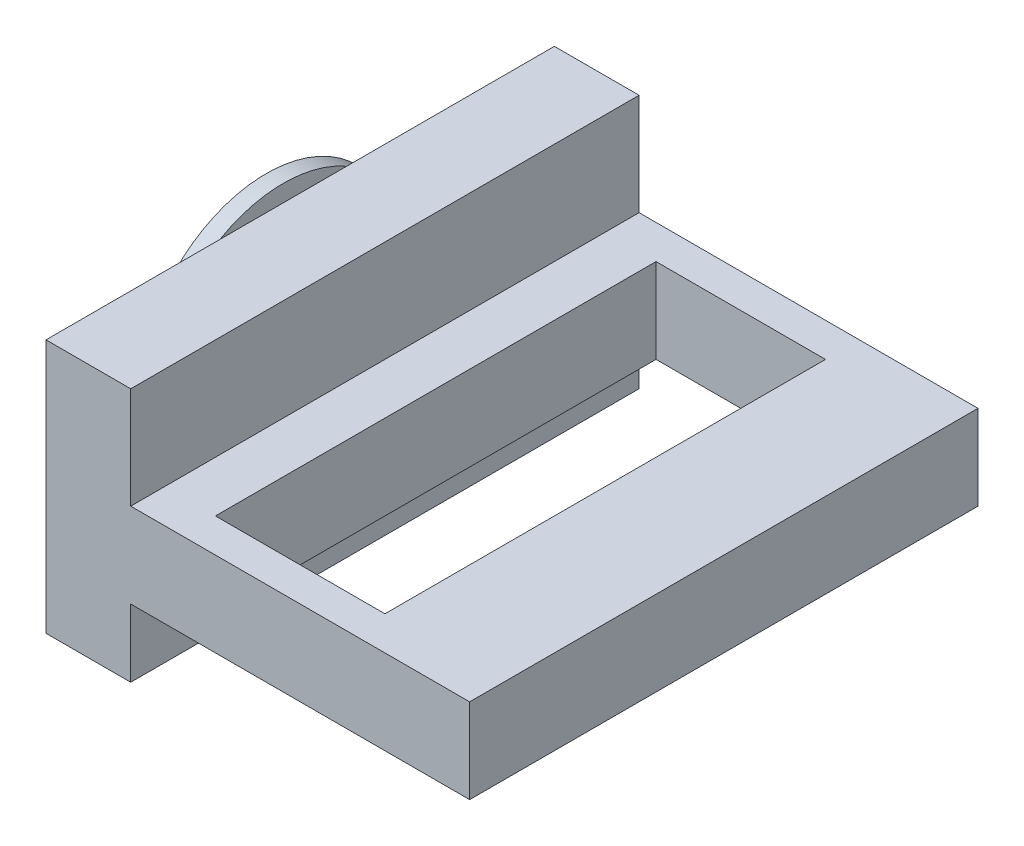
ISO-10303-21;
HEADER;
FILE_DESCRIPTION(('STEP AP214'),'2;1');
FILE_NAME('part.step','',(''),(''),'','','');
FILE_SCHEMA(('AUTOMOTIVE_DESIGN { 1 0 10303 214 1 1 1 1 }'));
ENDSEC;
DATA;
#1=APPLICATION_CONTEXT('core data for automotive mechanical design processes');
#2=APPLICATION_PROTOCOL_DEFINITION('international standard','automotive_design',2000,#1);
#3=PRODUCT_CONTEXT('',#1,'mechanical');
#4=PRODUCT('Part','Part','',(#3));
#5=PRODUCT_RELATED_PRODUCT_CATEGORY('part','',(#4));
#6=PRODUCT_DEFINITION_FORMATION('','',#4);
#7=PRODUCT_DEFINITION_CONTEXT('part definition',#1,'design');
#8=PRODUCT_DEFINITION('design','',#6,#7);
#9=PRODUCT_DEFINITION_SHAPE('','',#8);
#10=(LENGTH_UNIT() NAMED_UNIT(*) SI_UNIT(.MILLI.,.METRE.));
#11=(NAMED_UNIT(*) PLANE_ANGLE_UNIT() SI_UNIT($,.RADIAN.));
#12=(NAMED_UNIT(*) SI_UNIT($,.STERADIAN.) SOLID_ANGLE_UNIT());
#13=UNCERTAINTY_MEASURE_WITH_UNIT(LENGTH_MEASURE(1.E-05),#10,'distance_accuracy_value','');
#14=(GEOMETRIC_REPRESENTATION_CONTEXT(3) GLOBAL_UNCERTAINTY_ASSIGNED_CONTEXT((#13)) GLOBAL_UNIT_ASSIGNED_CONTEXT((#10,
#11,#12)) REPRESENTATION_CONTEXT('',''));
#15=CARTESIAN_POINT('',(0.,0.,0.));
#16=DIRECTION('',(0.,0.,1.));
#17=DIRECTION('',(1.,0.,0.));
#18=AXIS2_PLACEMENT_3D('',#15,#16,#17);
#19=CARTESIAN_POINT('',(-5.17985471020153,6.18497109826589,30.));
#20=DIRECTION('',(0.,-1.,0.));
#21=DIRECTION('',(0.,0.,-1.));
#22=AXIS2_PLACEMENT_3D('',#19,#20,#21);
#23=PLANE('',#22);
#24=DIRECTION('',(-1.,0.,0.));
#25=VECTOR('',#24,1.);
#26=CARTESIAN_POINT('',(-5.17985471020153,6.18497109826589,0.));
#27=LINE('',#26,#25);
#28=CARTESIAN_POINT('',(-5.17985471020153,6.18497109826589,0.));
#29=VERTEX_POINT('',#28);
#30=CARTESIAN_POINT('',(-10.1798547102015,6.18497109826589,0.));
#31=VERTEX_POINT('',#30);
#32=EDGE_CURVE('E172',#29,#31,#27,.T.);
#33=ORIENTED_EDGE('',*,*,#32,.T.);
#34=DIRECTION('',(0.,0.,-1.));
#35=VECTOR('',#34,1.);
#36=CARTESIAN_POINT('',(-10.1798547102015,6.18497109826589,30.));
#37=LINE('',#36,#35);
#38=CARTESIAN_POINT('',(-10.1798547102015,6.18497109826589,30.));
#39=VERTEX_POINT('',#38);
#40=EDGE_CURVE('E49',#39,#31,#37,.T.);
#41=ORIENTED_EDGE('',*,*,#40,.F.);
#42=DIRECTION('',(-1.,0.,0.));
#43=VECTOR('',#42,1.);
#44=CARTESIAN_POINT('',(-5.17985471020153,6.18497109826589,30.));
#45=LINE('',#44,#43);
#46=CARTESIAN_POINT('',(-5.17985471020153,6.18497109826589,30.));
#47=VERTEX_POINT('',#46);
#48=EDGE_CURVE('E176',#47,#39,#45,.T.);
#49=ORIENTED_EDGE('',*,*,#48,.F.);
#50=DIRECTION('',(0.,0.,-1.));
#51=VECTOR('',#50,1.);
#52=CARTESIAN_POINT('',(-5.17985471020153,6.18497109826589,30.));
#53=LINE('',#52,#51);
#54=EDGE_CURVE('E194',#47,#29,#53,.T.);
#55=ORIENTED_EDGE('',*,*,#54,.T.);
#56=EDGE_LOOP('',(#33,#41,#49,#55));
#57=FACE_BOUND('',#56,.T.);
#58=ADVANCED_FACE('F46',(#57),#23,.F.);
#59=CARTESIAN_POINT('',(-10.1798547102015,6.18497109826589,30.));
#60=DIRECTION('',(1.,0.,0.));
#61=DIRECTION('',(0.,0.,-1.));
#62=AXIS2_PLACEMENT_3D('',#59,#60,#61);
#63=PLANE('',#62);
#64=CARTESIAN_POINT('',(-10.1798547102015,-1.31502890173411,15.));
#65=DIRECTION('',(-1.,0.,0.));
#66=DIRECTION('',(0.,0.,1.));
#67=AXIS2_PLACEMENT_3D('',#64,#65,#66);
#68=CIRCLE('',#67,5.);
#69=CARTESIAN_POINT('',(-10.1798547102015,-1.31502890173411,20.));
#70=VERTEX_POINT('',#69);
#71=EDGE_CURVE('E54',#70,#70,#68,.T.);
#72=ORIENTED_EDGE('',*,*,#71,.F.);
#73=EDGE_LOOP('',(#72));
#74=FACE_BOUND('',#73,.T.);
#75=DIRECTION('',(0.,-1.,0.));
#76=VECTOR('',#75,1.);
#77=CARTESIAN_POINT('',(-10.1798547102015,6.18497109826589,0.));
#78=LINE('',#77,#76);
#79=CARTESIAN_POINT('',(-10.1798547102015,-8.81502890173411,0.));
#80=VERTEX_POINT('',#79);
#81=EDGE_CURVE('E197',#31,#80,#78,.T.);
#82=ORIENTED_EDGE('',*,*,#81,.T.);
#83=DIRECTION('',(0.,0.,-1.));
#84=VECTOR('',#83,1.);
#85=CARTESIAN_POINT('',(-10.1798547102015,-8.81502890173411,30.));
#86=LINE('',#85,#84);
#87=CARTESIAN_POINT('',(-10.1798547102015,-8.81502890173411,30.));
#88=VERTEX_POINT('',#87);
#89=EDGE_CURVE('E226',#88,#80,#86,.T.);
#90=ORIENTED_EDGE('',*,*,#89,.F.);
#91=DIRECTION('',(0.,-1.,0.));
#92=VECTOR('',#91,1.);
#93=CARTESIAN_POINT('',(-10.1798547102015,6.18497109826589,30.));
#94=LINE('',#93,#92);
#95=EDGE_CURVE('E179',#39,#88,#94,.T.);
#96=ORIENTED_EDGE('',*,*,#95,.F.);
#97=ORIENTED_EDGE('',*,*,#40,.T.);
#98=EDGE_LOOP('',(#82,#90,#96,#97));
#99=FACE_BOUND('',#98,.T.);
#100=ADVANCED_FACE('F240',(#74,#99),#63,.F.);
#101=CARTESIAN_POINT('',(-10.1798547102015,-8.81502890173411,30.));
#102=DIRECTION('',(0.,1.,0.));
#103=DIRECTION('',(0.,0.,1.));
#104=AXIS2_PLACEMENT_3D('',#101,#102,#103);
#105=PLANE('',#104);
#106=DIRECTION('',(1.,0.,0.));
#107=VECTOR('',#106,1.);
#108=CARTESIAN_POINT('',(-10.1798547102015,-8.81502890173411,0.));
#109=LINE('',#108,#107);
#110=CARTESIAN_POINT('',(-5.17985471020152,-8.81502890173411,0.));
#111=VERTEX_POINT('',#110);
#112=EDGE_CURVE('E199',#80,#111,#109,.T.);
#113=ORIENTED_EDGE('',*,*,#112,.T.);
#114=DIRECTION('',(0.,0.,-1.));
#115=VECTOR('',#114,1.);
#116=CARTESIAN_POINT('',(-5.17985471020152,-8.81502890173411,30.));
#117=LINE('',#116,#115);
#118=CARTESIAN_POINT('',(-5.17985471020152,-8.81502890173411,30.));
#119=VERTEX_POINT('',#118);
#120=EDGE_CURVE('E224',#119,#111,#117,.T.);
#121=ORIENTED_EDGE('',*,*,#120,.F.);
#122=DIRECTION('',(1.,0.,0.));
#123=VECTOR('',#122,1.);
#124=CARTESIAN_POINT('',(-10.1798547102015,-8.81502890173411,30.));
#125=LINE('',#124,#123);
#126=EDGE_CURVE('E182',#88,#119,#125,.T.);
#127=ORIENTED_EDGE('',*,*,#126,.F.);
#128=ORIENTED_EDGE('',*,*,#89,.T.);
#129=EDGE_LOOP('',(#113,#121,#127,#128));
#130=FACE_BOUND('',#129,.T.);
#131=ADVANCED_FACE('F242',(#130),#105,.F.);
#132=CARTESIAN_POINT('',(-5.17985471020152,-8.81502890173411,30.));
#133=DIRECTION('',(-1.,0.,0.));
#134=DIRECTION('',(0.,0.,1.));
#135=AXIS2_PLACEMENT_3D('',#132,#133,#134);
#136=PLANE('',#135);
#137=DIRECTION('',(0.,1.,0.));
#138=VECTOR('',#137,1.);
#139=CARTESIAN_POINT('',(-5.17985471020152,-8.81502890173411,0.));
#140=LINE('',#139,#138);
#141=CARTESIAN_POINT('',(-5.17985471020152,-4.81502890173411,0.));
#142=VERTEX_POINT('',#141);
#143=EDGE_CURVE('E201',#111,#142,#140,.T.);
#144=ORIENTED_EDGE('',*,*,#143,.T.);
#145=DIRECTION('',(0.,0.,-1.));
#146=VECTOR('',#145,1.);
#147=CARTESIAN_POINT('',(-5.17985471020152,-4.81502890173411,30.));
#148=LINE('',#147,#146);
#149=CARTESIAN_POINT('',(-5.17985471020152,-4.81502890173411,30.));
#150=VERTEX_POINT('',#149);
#151=EDGE_CURVE('E221',#150,#142,#148,.T.);
#152=ORIENTED_EDGE('',*,*,#151,.F.);
#153=DIRECTION('',(0.,1.,0.));
#154=VECTOR('',#153,1.);
#155=CARTESIAN_POINT('',(-5.17985471020152,-8.81502890173411,30.));
#156=LINE('',#155,#154);
#157=EDGE_CURVE('E184',#119,#150,#156,.T.);
#158=ORIENTED_EDGE('',*,*,#157,.F.);
#159=ORIENTED_EDGE('',*,*,#120,.T.);
#160=EDGE_LOOP('',(#144,#152,#158,#159));
#161=FACE_BOUND('',#160,.T.);
#162=ADVANCED_FACE('F252',(#161),#136,.F.);
#163=CARTESIAN_POINT('',(-5.17985471020152,-4.81502890173411,30.));
#164=DIRECTION('',(0.,1.,0.));
#165=DIRECTION('',(0.,0.,1.));
#166=AXIS2_PLACEMENT_3D('',#163,#164,#165);
#167=PLANE('',#166);
#168=DIRECTION('',(0.,0.,-1.));
#169=VECTOR('',#168,1.);
#170=CARTESIAN_POINT('',(7.82014528979847,-4.81502890173411,28.));
#171=LINE('',#170,#169);
#172=CARTESIAN_POINT('',(7.82014528979847,-4.81502890173411,28.));
#173=VERTEX_POINT('',#172);
#174=CARTESIAN_POINT('',(7.82014528979847,-4.81502890173411,2.));
#175=VERTEX_POINT('',#174);
#176=EDGE_CURVE('E144',#173,#175,#171,.T.);
#177=ORIENTED_EDGE('',*,*,#176,.T.);
#178=DIRECTION('',(-1.,0.,0.));
#179=VECTOR('',#178,1.);
#180=CARTESIAN_POINT('',(7.82014528979847,-4.81502890173411,2.));
#181=LINE('',#180,#179);
#182=CARTESIAN_POINT('',(-2.17985471020153,-4.81502890173411,2.));
#183=VERTEX_POINT('',#182);
#184=EDGE_CURVE('E138',#175,#183,#181,.T.);
#185=ORIENTED_EDGE('',*,*,#184,.T.);
#186=DIRECTION('',(0.,0.,1.));
#187=VECTOR('',#186,1.);
#188=CARTESIAN_POINT('',(-2.17985471020153,-4.81502890173411,2.));
#189=LINE('',#188,#187);
#190=CARTESIAN_POINT('',(-2.17985471020153,-4.81502890173411,28.));
#191=VERTEX_POINT('',#190);
#192=EDGE_CURVE('E147',#183,#191,#189,.T.);
#193=ORIENTED_EDGE('',*,*,#192,.T.);
#194=DIRECTION('',(1.,0.,0.));
#195=VECTOR('',#194,1.);
#196=CARTESIAN_POINT('',(-2.17985471020153,-4.81502890173411,28.));
#197=LINE('',#196,#195);
#198=EDGE_CURVE('E62',#191,#173,#197,.T.);
#199=ORIENTED_EDGE('',*,*,#198,.T.);
#200=EDGE_LOOP('',(#177,#185,#193,#199));
#201=FACE_BOUND('',#200,.T.);
#202=DIRECTION('',(1.,0.,0.));
#203=VECTOR('',#202,1.);
#204=CARTESIAN_POINT('',(-5.17985471020152,-4.81502890173411,0.));
#205=LINE('',#204,#203);
#206=CARTESIAN_POINT('',(14.8201452897985,-4.81502890173411,0.));
#207=VERTEX_POINT('',#206);
#208=EDGE_CURVE('E203',#142,#207,#205,.T.);
#209=ORIENTED_EDGE('',*,*,#208,.T.);
#210=DIRECTION('',(0.,0.,-1.));
#211=VECTOR('',#210,1.);
#212=CARTESIAN_POINT('',(14.8201452897985,-4.81502890173411,30.));
#213=LINE('',#212,#211);
#214=CARTESIAN_POINT('',(14.8201452897985,-4.81502890173411,30.));
#215=VERTEX_POINT('',#214);
#216=EDGE_CURVE('E218',#215,#207,#213,.T.);
#217=ORIENTED_EDGE('',*,*,#216,.F.);
#218=DIRECTION('',(1.,0.,0.));
#219=VECTOR('',#218,1.);
#220=CARTESIAN_POINT('',(-5.17985471020152,-4.81502890173411,30.));
#221=LINE('',#220,#219);
#222=EDGE_CURVE('E186',#150,#215,#221,.T.);
#223=ORIENTED_EDGE('',*,*,#222,.F.);
#224=ORIENTED_EDGE('',*,*,#151,.T.);
#225=EDGE_LOOP('',(#209,#217,#223,#224));
#226=FACE_BOUND('',#225,.T.);
#227=ADVANCED_FACE('F151',(#201,#226),#167,.F.);
#228=CARTESIAN_POINT('',(14.8201452897985,-4.81502890173411,30.));
#229=DIRECTION('',(-1.,0.,0.));
#230=DIRECTION('',(0.,-1.,0.));
#231=AXIS2_PLACEMENT_3D('',#228,#229,#230);
#232=PLANE('',#231);
#233=DIRECTION('',(0.,1.,0.));
#234=VECTOR('',#233,1.);
#235=CARTESIAN_POINT('',(14.8201452897985,-4.81502890173411,0.));
#236=LINE('',#235,#234);
#237=CARTESIAN_POINT('',(14.8201452897985,0.184971098265892,0.));
#238=VERTEX_POINT('',#237);
#239=EDGE_CURVE('E205',#207,#238,#236,.T.);
#240=ORIENTED_EDGE('',*,*,#239,.T.);
#241=DIRECTION('',(0.,0.,-1.));
#242=VECTOR('',#241,1.);
#243=CARTESIAN_POINT('',(14.8201452897985,0.184971098265892,30.));
#244=LINE('',#243,#242);
#245=CARTESIAN_POINT('',(14.8201452897985,0.184971098265892,30.));
#246=VERTEX_POINT('',#245);
#247=EDGE_CURVE('E215',#246,#238,#244,.T.);
#248=ORIENTED_EDGE('',*,*,#247,.F.);
#249=DIRECTION('',(0.,1.,0.));
#250=VECTOR('',#249,1.);
#251=CARTESIAN_POINT('',(14.8201452897985,-4.81502890173411,30.));
#252=LINE('',#251,#250);
#253=EDGE_CURVE('E188',#215,#246,#252,.T.);
#254=ORIENTED_EDGE('',*,*,#253,.F.);
#255=ORIENTED_EDGE('',*,*,#216,.T.);
#256=EDGE_LOOP('',(#240,#248,#254,#255));
#257=FACE_BOUND('',#256,.T.);
#258=ADVANCED_FACE('F273',(#257),#232,.F.);
#259=CARTESIAN_POINT('',(14.8201452897985,0.184971098265892,30.));
#260=DIRECTION('',(0.,-1.,0.));
#261=DIRECTION('',(1.,0.,0.));
#262=AXIS2_PLACEMENT_3D('',#259,#260,#261);
#263=PLANE('',#262);
#264=DIRECTION('',(0.,0.,1.));
#265=VECTOR('',#264,1.);
#266=CARTESIAN_POINT('',(-2.17985471020153,0.18497109826589,2.));
#267=LINE('',#266,#265);
#268=CARTESIAN_POINT('',(-2.17985471020153,0.18497109826589,2.));
#269=VERTEX_POINT('',#268);
#270=CARTESIAN_POINT('',(-2.17985471020153,0.18497109826589,28.));
#271=VERTEX_POINT('',#270);
#272=EDGE_CURVE('E165',#269,#271,#267,.T.);
#273=ORIENTED_EDGE('',*,*,#272,.F.);
#274=DIRECTION('',(-1.,0.,0.));
#275=VECTOR('',#274,1.);
#276=CARTESIAN_POINT('',(7.82014528979847,0.184971098265891,2.));
#277=LINE('',#276,#275);
#278=CARTESIAN_POINT('',(7.82014528979847,0.184971098265891,2.));
#279=VERTEX_POINT('',#278);
#280=EDGE_CURVE('E70',#279,#269,#277,.T.);
#281=ORIENTED_EDGE('',*,*,#280,.F.);
#282=DIRECTION('',(0.,0.,-1.));
#283=VECTOR('',#282,1.);
#284=CARTESIAN_POINT('',(7.82014528979847,0.184971098265891,28.));
#285=LINE('',#284,#283);
#286=CARTESIAN_POINT('',(7.82014528979847,0.184971098265891,28.));
#287=VERTEX_POINT('',#286);
#288=EDGE_CURVE('E154',#287,#279,#285,.T.);
#289=ORIENTED_EDGE('',*,*,#288,.F.);
#290=DIRECTION('',(1.,0.,0.));
#291=VECTOR('',#290,1.);
#292=CARTESIAN_POINT('',(-2.17985471020153,0.18497109826589,28.));
#293=LINE('',#292,#291);
#294=EDGE_CURVE('E157',#271,#287,#293,.T.);
#295=ORIENTED_EDGE('',*,*,#294,.F.);
#296=EDGE_LOOP('',(#273,#281,#289,#295));
#297=FACE_BOUND('',#296,.T.);
#298=DIRECTION('',(-1.,0.,0.));
#299=VECTOR('',#298,1.);
#300=CARTESIAN_POINT('',(14.8201452897985,0.184971098265892,0.));
#301=LINE('',#300,#299);
#302=CARTESIAN_POINT('',(-5.17985471020153,0.184971098265889,0.));
#303=VERTEX_POINT('',#302);
#304=EDGE_CURVE('E207',#238,#303,#301,.T.);
#305=ORIENTED_EDGE('',*,*,#304,.T.);
#306=DIRECTION('',(0.,0.,-1.));
#307=VECTOR('',#306,1.);
#308=CARTESIAN_POINT('',(-5.17985471020153,0.184971098265889,30.));
#309=LINE('',#308,#307);
#310=CARTESIAN_POINT('',(-5.17985471020153,0.184971098265889,30.));
#311=VERTEX_POINT('',#310);
#312=EDGE_CURVE('E212',#311,#303,#309,.T.);
#313=ORIENTED_EDGE('',*,*,#312,.F.);
#314=DIRECTION('',(-1.,0.,0.));
#315=VECTOR('',#314,1.);
#316=CARTESIAN_POINT('',(14.8201452897985,0.184971098265892,30.));
#317=LINE('',#316,#315);
#318=EDGE_CURVE('E190',#246,#311,#317,.T.);
#319=ORIENTED_EDGE('',*,*,#318,.F.);
#320=ORIENTED_EDGE('',*,*,#247,.T.);
#321=EDGE_LOOP('',(#305,#313,#319,#320));
#322=FACE_BOUND('',#321,.T.);
#323=ADVANCED_FACE('F268',(#297,#322),#263,.F.);
#324=CARTESIAN_POINT('',(-5.17985471020153,0.184971098265889,30.));
#325=DIRECTION('',(-1.,0.,0.));
#326=DIRECTION('',(0.,0.,1.));
#327=AXIS2_PLACEMENT_3D('',#324,#325,#326);
#328=PLANE('',#327);
#329=DIRECTION('',(0.,1.,0.));
#330=VECTOR('',#329,1.);
#331=CARTESIAN_POINT('',(-5.17985471020153,0.184971098265889,0.));
#332=LINE('',#331,#330);
#333=EDGE_CURVE('E180',#303,#29,#332,.T.);
#334=ORIENTED_EDGE('',*,*,#333,.T.);
#335=ORIENTED_EDGE('',*,*,#54,.F.);
#336=DIRECTION('',(0.,1.,0.));
#337=VECTOR('',#336,1.);
#338=CARTESIAN_POINT('',(-5.17985471020153,0.184971098265889,30.));
#339=LINE('',#338,#337);
#340=EDGE_CURVE('E192',#311,#47,#339,.T.);
#341=ORIENTED_EDGE('',*,*,#340,.F.);
#342=ORIENTED_EDGE('',*,*,#312,.T.);
#343=EDGE_LOOP('',(#334,#335,#341,#342));
#344=FACE_BOUND('',#343,.T.);
#345=ADVANCED_FACE('F263',(#344),#328,.F.);
#346=CARTESIAN_POINT('',(0.,0.,30.));
#347=DIRECTION('',(0.,0.,1.));
#348=DIRECTION('',(1.,0.,0.));
#349=AXIS2_PLACEMENT_3D('',#346,#347,#348);
#350=PLANE('',#349);
#351=ORIENTED_EDGE('',*,*,#48,.T.);
#352=ORIENTED_EDGE('',*,*,#95,.T.);
#353=ORIENTED_EDGE('',*,*,#126,.T.);
#354=ORIENTED_EDGE('',*,*,#157,.T.);
#355=ORIENTED_EDGE('',*,*,#222,.T.);
#356=ORIENTED_EDGE('',*,*,#253,.T.);
#357=ORIENTED_EDGE('',*,*,#318,.T.);
#358=ORIENTED_EDGE('',*,*,#340,.T.);
#359=EDGE_LOOP('',(#351,#352,#353,#354,#355,#356,#357,#358));
#360=FACE_BOUND('',#359,.T.);
#361=ADVANCED_FACE('F256',(#360),#350,.T.);
#362=CARTESIAN_POINT('',(0.,0.,0.));
#363=DIRECTION('',(0.,0.,1.));
#364=DIRECTION('',(1.,0.,0.));
#365=AXIS2_PLACEMENT_3D('',#362,#363,#364);
#366=PLANE('',#365);
#367=ORIENTED_EDGE('',*,*,#32,.F.);
#368=ORIENTED_EDGE('',*,*,#333,.F.);
#369=ORIENTED_EDGE('',*,*,#304,.F.);
#370=ORIENTED_EDGE('',*,*,#239,.F.);
#371=ORIENTED_EDGE('',*,*,#208,.F.);
#372=ORIENTED_EDGE('',*,*,#143,.F.);
#373=ORIENTED_EDGE('',*,*,#112,.F.);
#374=ORIENTED_EDGE('',*,*,#81,.F.);
#375=EDGE_LOOP('',(#367,#368,#369,#370,#371,#372,#373,#374));
#376=FACE_BOUND('',#375,.T.);
#377=ADVANCED_FACE('F245',(#376),#366,.F.);
#378=CARTESIAN_POINT('',(7.82014528979847,-4.81502890173411,2.));
#379=DIRECTION('',(0.,0.,-1.));
#380=DIRECTION('',(-1.,0.,0.));
#381=AXIS2_PLACEMENT_3D('',#378,#379,#380);
#382=PLANE('',#381);
#383=ORIENTED_EDGE('',*,*,#280,.T.);
#384=DIRECTION('',(0.,1.,0.));
#385=VECTOR('',#384,1.);
#386=CARTESIAN_POINT('',(-2.17985471020153,-4.81502890173411,2.));
#387=LINE('',#386,#385);
#388=EDGE_CURVE('E134',#183,#269,#387,.T.);
#389=ORIENTED_EDGE('',*,*,#388,.F.);
#390=ORIENTED_EDGE('',*,*,#184,.F.);
#391=DIRECTION('',(0.,1.,0.));
#392=VECTOR('',#391,1.);
#393=CARTESIAN_POINT('',(7.82014528979847,-4.81502890173411,2.));
#394=LINE('',#393,#392);
#395=EDGE_CURVE('E170',#175,#279,#394,.T.);
#396=ORIENTED_EDGE('',*,*,#395,.T.);
#397=EDGE_LOOP('',(#383,#389,#390,#396));
#398=FACE_BOUND('',#397,.T.);
#399=ADVANCED_FACE('F136',(#398),#382,.F.);
#400=CARTESIAN_POINT('',(7.82014528979847,-4.81502890173411,28.));
#401=DIRECTION('',(1.,0.,0.));
#402=DIRECTION('',(0.,1.,0.));
#403=AXIS2_PLACEMENT_3D('',#400,#401,#402);
#404=PLANE('',#403);
#405=ORIENTED_EDGE('',*,*,#288,.T.);
#406=ORIENTED_EDGE('',*,*,#395,.F.);
#407=ORIENTED_EDGE('',*,*,#176,.F.);
#408=DIRECTION('',(0.,1.,0.));
#409=VECTOR('',#408,1.);
#410=CARTESIAN_POINT('',(7.82014528979847,-4.81502890173411,28.));
#411=LINE('',#410,#409);
#412=EDGE_CURVE('E173',#173,#287,#411,.T.);
#413=ORIENTED_EDGE('',*,*,#412,.T.);
#414=EDGE_LOOP('',(#405,#406,#407,#413));
#415=FACE_BOUND('',#414,.T.);
#416=ADVANCED_FACE('F353',(#415),#404,.F.);
#417=CARTESIAN_POINT('',(-2.17985471020153,-4.81502890173411,28.));
#418=DIRECTION('',(0.,0.,1.));
#419=DIRECTION('',(1.,0.,0.));
#420=AXIS2_PLACEMENT_3D('',#417,#418,#419);
#421=PLANE('',#420);
#422=ORIENTED_EDGE('',*,*,#294,.T.);
#423=ORIENTED_EDGE('',*,*,#412,.F.);
#424=ORIENTED_EDGE('',*,*,#198,.F.);
#425=DIRECTION('',(0.,1.,0.));
#426=VECTOR('',#425,1.);
#427=CARTESIAN_POINT('',(-2.17985471020153,-4.81502890173411,28.));
#428=LINE('',#427,#426);
#429=EDGE_CURVE('E143',#191,#271,#428,.T.);
#430=ORIENTED_EDGE('',*,*,#429,.T.);
#431=EDGE_LOOP('',(#422,#423,#424,#430));
#432=FACE_BOUND('',#431,.T.);
#433=ADVANCED_FACE('F362',(#432),#421,.F.);
#434=CARTESIAN_POINT('',(-2.17985471020153,-4.81502890173411,2.));
#435=DIRECTION('',(-1.,0.,0.));
#436=DIRECTION('',(0.,0.,1.));
#437=AXIS2_PLACEMENT_3D('',#434,#435,#436);
#438=PLANE('',#437);
#439=ORIENTED_EDGE('',*,*,#272,.T.);
#440=ORIENTED_EDGE('',*,*,#429,.F.);
#441=ORIENTED_EDGE('',*,*,#192,.F.);
#442=ORIENTED_EDGE('',*,*,#388,.T.);
#443=EDGE_LOOP('',(#439,#440,#441,#442));
#444=FACE_BOUND('',#443,.T.);
#445=ADVANCED_FACE('F148',(#444),#438,.F.);
#446=CARTESIAN_POINT('',(-11.1798547102015,-1.31502890173411,15.));
#447=DIRECTION('',(1.,0.,0.));
#448=DIRECTION('',(0.,0.,-1.));
#449=AXIS2_PLACEMENT_3D('',#446,#447,#448);
#450=CYLINDRICAL_SURFACE('',#449,5.);
#451=CARTESIAN_POINT('',(-11.1798547102015,-1.31502890173411,15.));
#452=DIRECTION('',(-1.,0.,0.));
#453=DIRECTION('',(0.,0.,1.));
#454=AXIS2_PLACEMENT_3D('',#451,#452,#453);
#455=CIRCLE('',#454,5.);
#456=CARTESIAN_POINT('',(-11.1798547102015,-1.31502890173411,20.));
#457=VERTEX_POINT('',#456);
#458=EDGE_CURVE('E166',#457,#457,#455,.T.);
#459=ORIENTED_EDGE('',*,*,#458,.F.);
#460=EDGE_LOOP('',(#459));
#461=FACE_BOUND('',#460,.T.);
#462=ORIENTED_EDGE('',*,*,#71,.T.);
#463=EDGE_LOOP('',(#462));
#464=FACE_BOUND('',#463,.T.);
#465=ADVANCED_FACE('F238',(#461,#464),#450,.T.);
#466=CARTESIAN_POINT('',(-12.1798547102015,-1.31502890173411,15.));
#467=DIRECTION('',(1.,0.,0.));
#468=DIRECTION('',(0.,0.,-1.));
#469=AXIS2_PLACEMENT_3D('',#466,#467,#468);
#470=CYLINDRICAL_SURFACE('',#469,7.5);
#471=CARTESIAN_POINT('',(-12.1798547102015,-1.31502890173411,15.));
#472=DIRECTION('',(-1.,0.,0.));
#473=DIRECTION('',(0.,0.,1.));
#474=AXIS2_PLACEMENT_3D('',#471,#472,#473);
#475=CIRCLE('',#474,7.5);
#476=CARTESIAN_POINT('',(-12.1798547102015,-1.31502890173411,22.5));
#477=VERTEX_POINT('',#476);
#478=EDGE_CURVE('E446',#477,#477,#475,.T.);
#479=ORIENTED_EDGE('',*,*,#478,.F.);
#480=EDGE_LOOP('',(#479));
#481=FACE_BOUND('',#480,.T.);
#482=CARTESIAN_POINT('',(-11.1798547102015,-1.31502890173411,15.));
#483=DIRECTION('',(-1.,0.,0.));
#484=DIRECTION('',(0.,0.,1.));
#485=AXIS2_PLACEMENT_3D('',#482,#483,#484);
#486=CIRCLE('',#485,7.5);
#487=CARTESIAN_POINT('',(-11.1798547102015,-1.31502890173411,22.5));
#488=VERTEX_POINT('',#487);
#489=EDGE_CURVE('E443',#488,#488,#486,.T.);
#490=ORIENTED_EDGE('',*,*,#489,.T.);
#491=EDGE_LOOP('',(#490));
#492=FACE_BOUND('',#491,.T.);
#493=ADVANCED_FACE('F386',(#481,#492),#470,.T.);
#494=CARTESIAN_POINT('',(-12.1798547102015,-1.31502890173411,15.));
#495=DIRECTION('',(-1.,0.,0.));
#496=DIRECTION('',(0.,0.,1.));
#497=AXIS2_PLACEMENT_3D('',#494,#495,#496);
#498=PLANE('',#497);
#499=CARTESIAN_POINT('',(-12.1798547102015,-1.31502890173411,15.));
#500=DIRECTION('',(-1.,0.,0.));
#501=DIRECTION('',(0.,0.,1.));
#502=AXIS2_PLACEMENT_3D('',#499,#500,#501);
#503=CIRCLE('',#502,5.);
#504=CARTESIAN_POINT('',(-12.1798547102015,-1.31502890173411,20.));
#505=VERTEX_POINT('',#504);
#506=EDGE_CURVE('E13',#505,#505,#503,.T.);
#507=ORIENTED_EDGE('',*,*,#506,.F.);
#508=EDGE_LOOP('',(#507));
#509=FACE_BOUND('',#508,.T.);
#510=ORIENTED_EDGE('',*,*,#478,.T.);
#511=EDGE_LOOP('',(#510));
#512=FACE_BOUND('',#511,.T.);
#513=ADVANCED_FACE('F393',(#509,#512),#498,.T.);
#514=CARTESIAN_POINT('',(-11.1798547102015,-1.31502890173411,15.));
#515=DIRECTION('',(-1.,0.,0.));
#516=DIRECTION('',(0.,0.,1.));
#517=AXIS2_PLACEMENT_3D('',#514,#515,#516);
#518=PLANE('',#517);
#519=ORIENTED_EDGE('',*,*,#458,.T.);
#520=EDGE_LOOP('',(#519));
#521=FACE_BOUND('',#520,.T.);
#522=ORIENTED_EDGE('',*,*,#489,.F.);
#523=EDGE_LOOP('',(#522));
#524=FACE_BOUND('',#523,.T.);
#525=ADVANCED_FACE('F402',(#521,#524),#518,.F.);
#526=CARTESIAN_POINT('',(-13.1798547102015,-1.31502890173411,15.));
#527=DIRECTION('',(1.,0.,0.));
#528=DIRECTION('',(0.,0.,-1.));
#529=AXIS2_PLACEMENT_3D('',#526,#527,#528);
#530=CYLINDRICAL_SURFACE('',#529,5.);
#531=CARTESIAN_POINT('',(-13.1798547102015,-1.31502890173411,15.));
#532=DIRECTION('',(-1.,0.,0.));
#533=DIRECTION('',(0.,0.,1.));
#534=AXIS2_PLACEMENT_3D('',#531,#532,#533);
#535=CIRCLE('',#534,5.);
#536=CARTESIAN_POINT('',(-13.1798547102015,-1.31502890173411,20.));
#537=VERTEX_POINT('',#536);
#538=EDGE_CURVE('E442',#537,#537,#535,.T.);
#539=ORIENTED_EDGE('',*,*,#538,.F.);
#540=EDGE_LOOP('',(#539));
#541=FACE_BOUND('',#540,.T.);
#542=ORIENTED_EDGE('',*,*,#506,.T.);
#543=EDGE_LOOP('',(#542));
#544=FACE_BOUND('',#543,.T.);
#545=ADVANCED_FACE('F410',(#541,#544),#530,.T.);
#546=CARTESIAN_POINT('',(-13.1798547102015,-1.31502890173411,15.));
#547=DIRECTION('',(-1.,0.,0.));
#548=DIRECTION('',(0.,0.,1.));
#549=AXIS2_PLACEMENT_3D('',#546,#547,#548);
#550=PLANE('',#549);
#551=ORIENTED_EDGE('',*,*,#538,.T.);
#552=EDGE_LOOP('',(#551));
#553=FACE_BOUND('',#552,.T.);
#554=ADVANCED_FACE('F417',(#553),#550,.T.);
#555=CLOSED_SHELL('',(#58,#100,#131,#162,#227,#258,#323,#345,#361,#377,#399,#416,#433,#445,#465,
#493,#513,#525,#545,#554));
#556=MANIFOLD_SOLID_BREP('B2',#555);
#557=ADVANCED_BREP_SHAPE_REPRESENTATION('',(#18,#556),#14);
#558=SHAPE_DEFINITION_REPRESENTATION(#9,#557);
ENDSEC;
END-ISO-10303-21;
